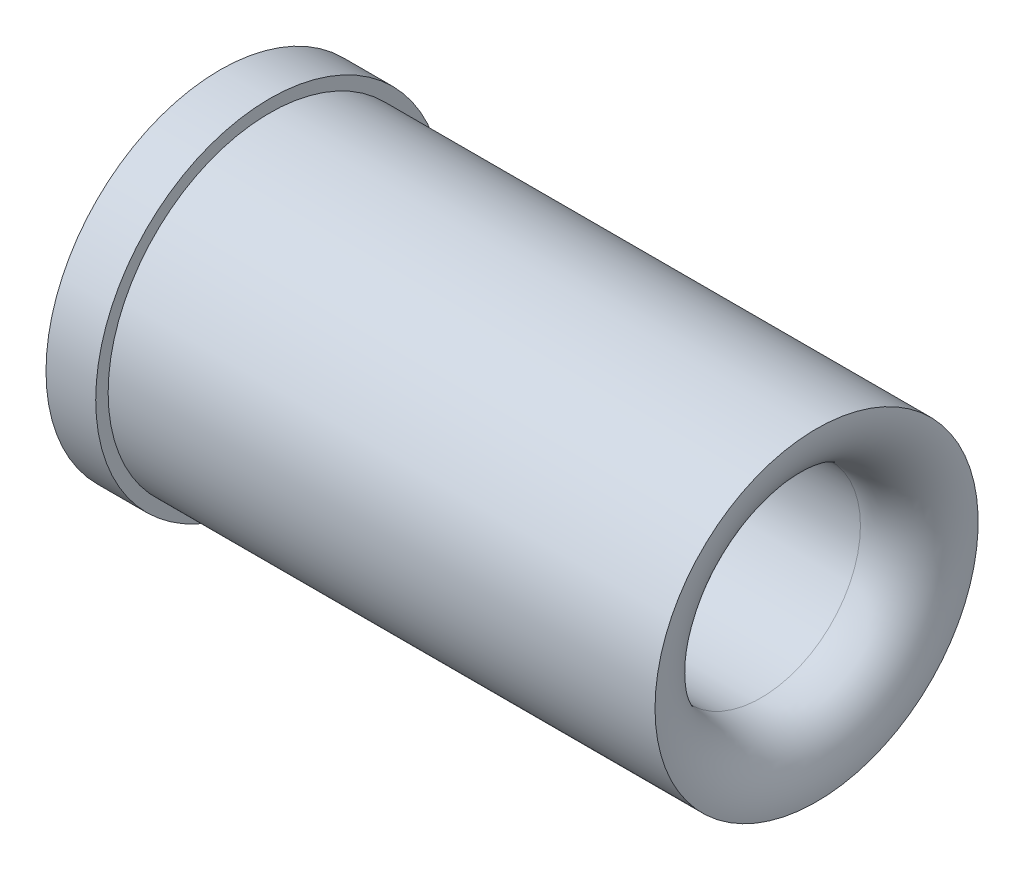
ISO-10303-21;
HEADER;
FILE_DESCRIPTION(('STEP AP214'),'2;1');
FILE_NAME('part.step','',(''),(''),'','','');
FILE_SCHEMA(('AUTOMOTIVE_DESIGN { 1 0 10303 214 1 1 1 1 }'));
ENDSEC;
DATA;
#1=APPLICATION_CONTEXT('core data for automotive mechanical design processes');
#2=APPLICATION_PROTOCOL_DEFINITION('international standard','automotive_design',2000,#1);
#3=PRODUCT_CONTEXT('',#1,'mechanical');
#4=PRODUCT('Part','Part','',(#3));
#5=PRODUCT_RELATED_PRODUCT_CATEGORY('part','',(#4));
#6=PRODUCT_DEFINITION_FORMATION('','',#4);
#7=PRODUCT_DEFINITION_CONTEXT('part definition',#1,'design');
#8=PRODUCT_DEFINITION('design','',#6,#7);
#9=PRODUCT_DEFINITION_SHAPE('','',#8);
#10=(LENGTH_UNIT() NAMED_UNIT(*) SI_UNIT(.MILLI.,.METRE.));
#11=(NAMED_UNIT(*) PLANE_ANGLE_UNIT() SI_UNIT($,.RADIAN.));
#12=(NAMED_UNIT(*) SI_UNIT($,.STERADIAN.) SOLID_ANGLE_UNIT());
#13=UNCERTAINTY_MEASURE_WITH_UNIT(LENGTH_MEASURE(1.E-05),#10,'distance_accuracy_value','');
#14=(GEOMETRIC_REPRESENTATION_CONTEXT(3) GLOBAL_UNCERTAINTY_ASSIGNED_CONTEXT((#13)) GLOBAL_UNIT_ASSIGNED_CONTEXT((#10,
#11,#12)) REPRESENTATION_CONTEXT('',''));
#15=CARTESIAN_POINT('',(0.,0.,0.));
#16=DIRECTION('',(0.,0.,1.));
#17=DIRECTION('',(1.,0.,0.));
#18=AXIS2_PLACEMENT_3D('',#15,#16,#17);
#19=CARTESIAN_POINT('',(12.1757416936097,-8.53326323507829,0.));
#20=DIRECTION('',(-1.,0.,0.));
#21=DIRECTION('',(0.,0.,1.));
#22=AXIS2_PLACEMENT_3D('',#19,#20,#21);
#23=CYLINDRICAL_SURFACE('',#22,2.);
#24=CARTESIAN_POINT('',(0.912123334161097,-8.53326323507829,0.));
#25=DIRECTION('',(-1.,0.,0.));
#26=DIRECTION('',(0.,0.,1.));
#27=AXIS2_PLACEMENT_3D('',#24,#25,#26);
#28=CIRCLE('',#27,2.);
#29=CARTESIAN_POINT('',(0.912123334161097,-8.53326323507829,2.));
#30=VERTEX_POINT('',#29);
#31=EDGE_CURVE('E10',#30,#30,#28,.T.);
#32=ORIENTED_EDGE('',*,*,#31,.T.);
#33=EDGE_LOOP('',(#32));
#34=FACE_BOUND('',#33,.T.);
#35=CARTESIAN_POINT('',(11.7940893454112,-8.53326323507829,0.));
#36=DIRECTION('',(-1.,0.,0.));
#37=DIRECTION('',(0.,0.,1.));
#38=AXIS2_PLACEMENT_3D('',#35,#36,#37);
#39=CIRCLE('',#38,2.);
#40=CARTESIAN_POINT('',(11.7940893454112,-8.53326323507829,2.));
#41=VERTEX_POINT('',#40);
#42=EDGE_CURVE('E55',#41,#41,#39,.T.);
#43=ORIENTED_EDGE('',*,*,#42,.F.);
#44=EDGE_LOOP('',(#43));
#45=FACE_BOUND('',#44,.T.);
#46=ADVANCED_FACE('F33',(#34,#45),#23,.F.);
#47=CARTESIAN_POINT('',(0.912123334161096,-6.53326323507829,0.));
#48=DIRECTION('',(-1.,0.,0.));
#49=DIRECTION('',(0.,0.,1.));
#50=AXIS2_PLACEMENT_3D('',#47,#48,#49);
#51=PLANE('',#50);
#52=CARTESIAN_POINT('',(0.912123334161097,-8.53326323507829,0.));
#53=DIRECTION('',(-1.,0.,0.));
#54=DIRECTION('',(0.,0.,1.));
#55=AXIS2_PLACEMENT_3D('',#52,#53,#54);
#56=CIRCLE('',#55,3.5);
#57=CARTESIAN_POINT('',(0.912123334161097,-8.53326323507829,3.5));
#58=VERTEX_POINT('',#57);
#59=EDGE_CURVE('E39',#58,#58,#56,.T.);
#60=ORIENTED_EDGE('',*,*,#59,.T.);
#61=EDGE_LOOP('',(#60));
#62=FACE_BOUND('',#61,.T.);
#63=ORIENTED_EDGE('',*,*,#31,.F.);
#64=EDGE_LOOP('',(#63));
#65=FACE_BOUND('',#64,.T.);
#66=ADVANCED_FACE('F63',(#62,#65),#51,.T.);
#67=CARTESIAN_POINT('',(12.1757416936097,-8.53326323507829,0.));
#68=DIRECTION('',(-1.,0.,0.));
#69=DIRECTION('',(0.,0.,1.));
#70=AXIS2_PLACEMENT_3D('',#67,#68,#69);
#71=CYLINDRICAL_SURFACE('',#70,3.5);
#72=CARTESIAN_POINT('',(1.9121233341611,-8.53326323507829,0.));
#73=DIRECTION('',(-1.,0.,0.));
#74=DIRECTION('',(0.,0.,1.));
#75=AXIS2_PLACEMENT_3D('',#72,#73,#74);
#76=CIRCLE('',#75,3.5);
#77=CARTESIAN_POINT('',(1.9121233341611,-8.53326323507829,3.5));
#78=VERTEX_POINT('',#77);
#79=EDGE_CURVE('E43',#78,#78,#76,.T.);
#80=ORIENTED_EDGE('',*,*,#79,.T.);
#81=EDGE_LOOP('',(#80));
#82=FACE_BOUND('',#81,.T.);
#83=ORIENTED_EDGE('',*,*,#59,.F.);
#84=EDGE_LOOP('',(#83));
#85=FACE_BOUND('',#84,.T.);
#86=ADVANCED_FACE('F67',(#82,#85),#71,.T.);
#87=CARTESIAN_POINT('',(1.9121233341611,-5.03326323507829,0.));
#88=DIRECTION('',(1.,0.,0.));
#89=DIRECTION('',(0.,0.,-1.));
#90=AXIS2_PLACEMENT_3D('',#87,#88,#89);
#91=PLANE('',#90);
#92=CARTESIAN_POINT('',(1.9121233341611,-8.53326323507829,0.));
#93=DIRECTION('',(-1.,0.,0.));
#94=DIRECTION('',(0.,0.,1.));
#95=AXIS2_PLACEMENT_3D('',#92,#93,#94);
#96=CIRCLE('',#95,3.25);
#97=CARTESIAN_POINT('',(1.9121233341611,-8.53326323507829,3.25));
#98=VERTEX_POINT('',#97);
#99=EDGE_CURVE('E47',#98,#98,#96,.T.);
#100=ORIENTED_EDGE('',*,*,#99,.T.);
#101=EDGE_LOOP('',(#100));
#102=FACE_BOUND('',#101,.T.);
#103=ORIENTED_EDGE('',*,*,#79,.F.);
#104=EDGE_LOOP('',(#103));
#105=FACE_BOUND('',#104,.T.);
#106=ADVANCED_FACE('F71',(#102,#105),#91,.T.);
#107=CARTESIAN_POINT('',(12.1757416936097,-8.53326323507829,0.));
#108=DIRECTION('',(-1.,0.,0.));
#109=DIRECTION('',(0.,0.,1.));
#110=AXIS2_PLACEMENT_3D('',#107,#108,#109);
#111=CYLINDRICAL_SURFACE('',#110,3.25);
#112=CARTESIAN_POINT('',(12.9121233341611,-8.53326323507829,0.));
#113=DIRECTION('',(-1.,0.,0.));
#114=DIRECTION('',(0.,0.,1.));
#115=AXIS2_PLACEMENT_3D('',#112,#113,#114);
#116=CIRCLE('',#115,3.25);
#117=CARTESIAN_POINT('',(12.9121233341611,-8.53326323507829,3.25));
#118=VERTEX_POINT('',#117);
#119=EDGE_CURVE('E52',#118,#118,#116,.T.);
#120=ORIENTED_EDGE('',*,*,#119,.T.);
#121=EDGE_LOOP('',(#120));
#122=FACE_BOUND('',#121,.T.);
#123=ORIENTED_EDGE('',*,*,#99,.F.);
#124=EDGE_LOOP('',(#123));
#125=FACE_BOUND('',#124,.T.);
#126=ADVANCED_FACE('F78',(#122,#125),#111,.T.);
#127=CARTESIAN_POINT('',(11.7940893454112,-8.53326323507829,0.));
#128=DIRECTION('',(-1.,0.,0.));
#129=DIRECTION('',(0.,0.,1.));
#130=AXIS2_PLACEMENT_3D('',#127,#128,#129);
#131=TOROIDAL_SURFACE('',#130,3.125,1.125);
#132=ORIENTED_EDGE('',*,*,#42,.T.);
#133=EDGE_LOOP('',(#132));
#134=FACE_BOUND('',#133,.T.);
#135=ORIENTED_EDGE('',*,*,#119,.F.);
#136=EDGE_LOOP('',(#135));
#137=FACE_BOUND('',#136,.T.);
#138=ADVANCED_FACE('F59',(#134,#137),#131,.T.);
#139=CLOSED_SHELL('',(#46,#66,#86,#106,#126,#138));
#140=MANIFOLD_SOLID_BREP('B2',#139);
#141=ADVANCED_BREP_SHAPE_REPRESENTATION('',(#18,#140),#14);
#142=SHAPE_DEFINITION_REPRESENTATION(#9,#141);
ENDSEC;
END-ISO-10303-21;
